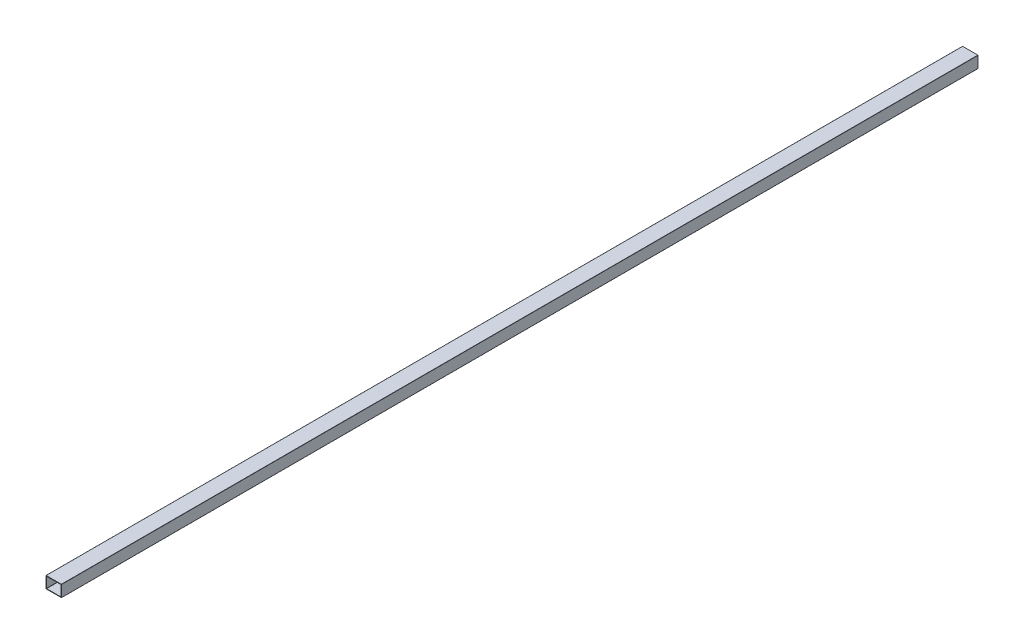
ISO-10303-21;
HEADER;
FILE_DESCRIPTION(('STEP AP214'),'2;1');
FILE_NAME('part.step','',(''),(''),'','','');
FILE_SCHEMA(('AUTOMOTIVE_DESIGN { 1 0 10303 214 1 1 1 1 }'));
ENDSEC;
DATA;
#1=APPLICATION_CONTEXT('core data for automotive mechanical design processes');
#2=APPLICATION_PROTOCOL_DEFINITION('international standard','automotive_design',2000,#1);
#3=PRODUCT_CONTEXT('',#1,'mechanical');
#4=PRODUCT('Part','Part','',(#3));
#5=PRODUCT_RELATED_PRODUCT_CATEGORY('part','',(#4));
#6=PRODUCT_DEFINITION_FORMATION('','',#4);
#7=PRODUCT_DEFINITION_CONTEXT('part definition',#1,'design');
#8=PRODUCT_DEFINITION('design','',#6,#7);
#9=PRODUCT_DEFINITION_SHAPE('','',#8);
#10=(LENGTH_UNIT() NAMED_UNIT(*) SI_UNIT(.MILLI.,.METRE.));
#11=(NAMED_UNIT(*) PLANE_ANGLE_UNIT() SI_UNIT($,.RADIAN.));
#12=(NAMED_UNIT(*) SI_UNIT($,.STERADIAN.) SOLID_ANGLE_UNIT());
#13=UNCERTAINTY_MEASURE_WITH_UNIT(LENGTH_MEASURE(1.E-05),#10,'distance_accuracy_value','');
#14=(GEOMETRIC_REPRESENTATION_CONTEXT(3) GLOBAL_UNCERTAINTY_ASSIGNED_CONTEXT((#13)) GLOBAL_UNIT_ASSIGNED_CONTEXT((#10,
#11,#12)) REPRESENTATION_CONTEXT('',''));
#15=CARTESIAN_POINT('',(0.,0.,0.));
#16=DIRECTION('',(0.,0.,1.));
#17=DIRECTION('',(1.,0.,0.));
#18=AXIS2_PLACEMENT_3D('',#15,#16,#17);
#19=CARTESIAN_POINT('',(50.8,-38.1,-6000.));
#20=DIRECTION('',(1.,0.,0.));
#21=DIRECTION('',(0.,0.,-1.));
#22=AXIS2_PLACEMENT_3D('',#19,#20,#21);
#23=PLANE('',#22);
#24=DIRECTION('',(0.,1.,0.));
#25=VECTOR('',#24,1.);
#26=CARTESIAN_POINT('',(50.8,-38.1,0.));
#27=LINE('',#26,#25);
#28=CARTESIAN_POINT('',(50.8,-37.1,0.));
#29=VERTEX_POINT('',#28);
#30=CARTESIAN_POINT('',(50.8,37.1,0.));
#31=VERTEX_POINT('',#30);
#32=EDGE_CURVE('E197',#29,#31,#27,.T.);
#33=ORIENTED_EDGE('',*,*,#32,.F.);
#34=DIRECTION('',(0.,0.,1.));
#35=VECTOR('',#34,1.);
#36=CARTESIAN_POINT('',(50.8,-37.1,-6000.));
#37=LINE('',#36,#35);
#38=CARTESIAN_POINT('',(50.8,-37.1,-6000.));
#39=VERTEX_POINT('',#38);
#40=EDGE_CURVE('E158',#29,#39,#37,.F.);
#41=ORIENTED_EDGE('',*,*,#40,.T.);
#42=DIRECTION('',(0.,1.,0.));
#43=VECTOR('',#42,1.);
#44=CARTESIAN_POINT('',(50.8,-38.1,-6000.));
#45=LINE('',#44,#43);
#46=CARTESIAN_POINT('',(50.8,37.1,-6000.));
#47=VERTEX_POINT('',#46);
#48=EDGE_CURVE('E185',#39,#47,#45,.T.);
#49=ORIENTED_EDGE('',*,*,#48,.T.);
#50=DIRECTION('',(0.,0.,1.));
#51=VECTOR('',#50,1.);
#52=CARTESIAN_POINT('',(50.8,37.1,-6000.));
#53=LINE('',#52,#51);
#54=EDGE_CURVE('E251',#47,#31,#53,.T.);
#55=ORIENTED_EDGE('',*,*,#54,.T.);
#56=EDGE_LOOP('',(#33,#41,#49,#55));
#57=FACE_BOUND('',#56,.T.);
#58=ADVANCED_FACE('F33',(#57),#23,.T.);
#59=CARTESIAN_POINT('',(-50.8,-38.1,-6000.));
#60=DIRECTION('',(0.,-1.,0.));
#61=DIRECTION('',(0.,0.,-1.));
#62=AXIS2_PLACEMENT_3D('',#59,#60,#61);
#63=PLANE('',#62);
#64=DIRECTION('',(1.,0.,0.));
#65=VECTOR('',#64,1.);
#66=CARTESIAN_POINT('',(-50.8,-38.1,0.));
#67=LINE('',#66,#65);
#68=CARTESIAN_POINT('',(-49.8,-38.1,0.));
#69=VERTEX_POINT('',#68);
#70=CARTESIAN_POINT('',(49.8,-38.1,0.));
#71=VERTEX_POINT('',#70);
#72=EDGE_CURVE('E189',#69,#71,#67,.T.);
#73=ORIENTED_EDGE('',*,*,#72,.F.);
#74=DIRECTION('',(0.,0.,1.));
#75=VECTOR('',#74,1.);
#76=CARTESIAN_POINT('',(-49.8,-38.1,-6000.));
#77=LINE('',#76,#75);
#78=CARTESIAN_POINT('',(-49.8,-38.1,-6000.));
#79=VERTEX_POINT('',#78);
#80=EDGE_CURVE('E238',#69,#79,#77,.F.);
#81=ORIENTED_EDGE('',*,*,#80,.T.);
#82=DIRECTION('',(1.,0.,0.));
#83=VECTOR('',#82,1.);
#84=CARTESIAN_POINT('',(-50.8,-38.1,-6000.));
#85=LINE('',#84,#83);
#86=CARTESIAN_POINT('',(49.8,-38.1,-6000.));
#87=VERTEX_POINT('',#86);
#88=EDGE_CURVE('E194',#79,#87,#85,.T.);
#89=ORIENTED_EDGE('',*,*,#88,.T.);
#90=DIRECTION('',(0.,0.,1.));
#91=VECTOR('',#90,1.);
#92=CARTESIAN_POINT('',(49.8,-38.1,-6000.));
#93=LINE('',#92,#91);
#94=EDGE_CURVE('E235',#87,#71,#93,.T.);
#95=ORIENTED_EDGE('',*,*,#94,.T.);
#96=EDGE_LOOP('',(#73,#81,#89,#95));
#97=FACE_BOUND('',#96,.T.);
#98=ADVANCED_FACE('F305',(#97),#63,.T.);
#99=CARTESIAN_POINT('',(-50.8,-38.1,-6000.));
#100=DIRECTION('',(-1.,0.,0.));
#101=DIRECTION('',(0.,0.,1.));
#102=AXIS2_PLACEMENT_3D('',#99,#100,#101);
#103=PLANE('',#102);
#104=DIRECTION('',(0.,-1.,0.));
#105=VECTOR('',#104,1.);
#106=CARTESIAN_POINT('',(-50.8,-38.1,-6000.));
#107=LINE('',#106,#105);
#108=CARTESIAN_POINT('',(-50.8,37.1,-6000.));
#109=VERTEX_POINT('',#108);
#110=CARTESIAN_POINT('',(-50.8,-37.1,-6000.));
#111=VERTEX_POINT('',#110);
#112=EDGE_CURVE('E191',#109,#111,#107,.T.);
#113=ORIENTED_EDGE('',*,*,#112,.T.);
#114=DIRECTION('',(0.,0.,1.));
#115=VECTOR('',#114,1.);
#116=CARTESIAN_POINT('',(-50.8,-37.1,-6000.));
#117=LINE('',#116,#115);
#118=CARTESIAN_POINT('',(-50.8,-37.1,0.));
#119=VERTEX_POINT('',#118);
#120=EDGE_CURVE('E224',#111,#119,#117,.T.);
#121=ORIENTED_EDGE('',*,*,#120,.T.);
#122=DIRECTION('',(0.,-1.,0.));
#123=VECTOR('',#122,1.);
#124=CARTESIAN_POINT('',(-50.8,-38.1,0.));
#125=LINE('',#124,#123);
#126=CARTESIAN_POINT('',(-50.8,37.1,0.));
#127=VERTEX_POINT('',#126);
#128=EDGE_CURVE('E203',#127,#119,#125,.T.);
#129=ORIENTED_EDGE('',*,*,#128,.F.);
#130=DIRECTION('',(0.,0.,1.));
#131=VECTOR('',#130,1.);
#132=CARTESIAN_POINT('',(-50.8,37.1,-6000.));
#133=LINE('',#132,#131);
#134=EDGE_CURVE('E222',#127,#109,#133,.F.);
#135=ORIENTED_EDGE('',*,*,#134,.T.);
#136=EDGE_LOOP('',(#113,#121,#129,#135));
#137=FACE_BOUND('',#136,.T.);
#138=ADVANCED_FACE('F311',(#137),#103,.T.);
#139=CARTESIAN_POINT('',(-50.8,38.1,-6000.));
#140=DIRECTION('',(0.,1.,0.));
#141=DIRECTION('',(0.,0.,1.));
#142=AXIS2_PLACEMENT_3D('',#139,#140,#141);
#143=PLANE('',#142);
#144=DIRECTION('',(-1.,0.,0.));
#145=VECTOR('',#144,1.);
#146=CARTESIAN_POINT('',(-50.8,38.1,-6000.));
#147=LINE('',#146,#145);
#148=CARTESIAN_POINT('',(49.8,38.1,-6000.));
#149=VERTEX_POINT('',#148);
#150=CARTESIAN_POINT('',(-49.8,38.1,-6000.));
#151=VERTEX_POINT('',#150);
#152=EDGE_CURVE('E188',#149,#151,#147,.T.);
#153=ORIENTED_EDGE('',*,*,#152,.T.);
#154=DIRECTION('',(0.,0.,1.));
#155=VECTOR('',#154,1.);
#156=CARTESIAN_POINT('',(-49.8,38.1,-6000.));
#157=LINE('',#156,#155);
#158=CARTESIAN_POINT('',(-49.8,38.1,0.));
#159=VERTEX_POINT('',#158);
#160=EDGE_CURVE('E248',#151,#159,#157,.T.);
#161=ORIENTED_EDGE('',*,*,#160,.T.);
#162=DIRECTION('',(-1.,0.,0.));
#163=VECTOR('',#162,1.);
#164=CARTESIAN_POINT('',(-50.8,38.1,0.));
#165=LINE('',#164,#163);
#166=CARTESIAN_POINT('',(49.8,38.1,0.));
#167=VERTEX_POINT('',#166);
#168=EDGE_CURVE('E200',#167,#159,#165,.T.);
#169=ORIENTED_EDGE('',*,*,#168,.F.);
#170=DIRECTION('',(0.,0.,1.));
#171=VECTOR('',#170,1.);
#172=CARTESIAN_POINT('',(49.8,38.1,-6000.));
#173=LINE('',#172,#171);
#174=EDGE_CURVE('E55',#167,#149,#173,.F.);
#175=ORIENTED_EDGE('',*,*,#174,.T.);
#176=EDGE_LOOP('',(#153,#161,#169,#175));
#177=FACE_BOUND('',#176,.T.);
#178=ADVANCED_FACE('F316',(#177),#143,.T.);
#179=CARTESIAN_POINT('',(0.,0.,-6000.));
#180=DIRECTION('',(0.,0.,-1.));
#181=DIRECTION('',(-1.,0.,0.));
#182=AXIS2_PLACEMENT_3D('',#179,#180,#181);
#183=PLANE('',#182);
#184=DIRECTION('',(0.,-1.,0.));
#185=VECTOR('',#184,1.);
#186=CARTESIAN_POINT('',(-47.76,-35.06,-6000.));
#187=LINE('',#186,#185);
#188=CARTESIAN_POINT('',(-47.76,34.06,-6000.));
#189=VERTEX_POINT('',#188);
#190=CARTESIAN_POINT('',(-47.76,-34.06,-6000.));
#191=VERTEX_POINT('',#190);
#192=EDGE_CURVE('E167',#189,#191,#187,.T.);
#193=ORIENTED_EDGE('',*,*,#192,.T.);
#194=CARTESIAN_POINT('',(-46.76,-34.06,-6000.));
#195=DIRECTION('',(0.,0.,-1.));
#196=DIRECTION('',(-1.,0.,0.));
#197=AXIS2_PLACEMENT_3D('',#194,#195,#196);
#198=CIRCLE('',#197,1.);
#199=CARTESIAN_POINT('',(-46.76,-35.06,-6000.));
#200=VERTEX_POINT('',#199);
#201=EDGE_CURVE('E11',#191,#200,#198,.F.);
#202=ORIENTED_EDGE('',*,*,#201,.T.);
#203=DIRECTION('',(1.,0.,0.));
#204=VECTOR('',#203,1.);
#205=CARTESIAN_POINT('',(-47.76,-35.06,-6000.));
#206=LINE('',#205,#204);
#207=CARTESIAN_POINT('',(46.76,-35.06,-6000.));
#208=VERTEX_POINT('',#207);
#209=EDGE_CURVE('E175',#200,#208,#206,.T.);
#210=ORIENTED_EDGE('',*,*,#209,.T.);
#211=CARTESIAN_POINT('',(46.76,-34.06,-6000.));
#212=DIRECTION('',(0.,0.,-1.));
#213=DIRECTION('',(-1.,0.,0.));
#214=AXIS2_PLACEMENT_3D('',#211,#212,#213);
#215=CIRCLE('',#214,1.);
#216=CARTESIAN_POINT('',(47.76,-34.06,-6000.));
#217=VERTEX_POINT('',#216);
#218=EDGE_CURVE('E262',#208,#217,#215,.F.);
#219=ORIENTED_EDGE('',*,*,#218,.T.);
#220=DIRECTION('',(0.,1.,0.));
#221=VECTOR('',#220,1.);
#222=CARTESIAN_POINT('',(47.76,-35.06,-6000.));
#223=LINE('',#222,#221);
#224=CARTESIAN_POINT('',(47.76,34.06,-6000.));
#225=VERTEX_POINT('',#224);
#226=EDGE_CURVE('E179',#217,#225,#223,.T.);
#227=ORIENTED_EDGE('',*,*,#226,.T.);
#228=CARTESIAN_POINT('',(46.76,34.06,-6000.));
#229=DIRECTION('',(0.,0.,-1.));
#230=DIRECTION('',(-1.,0.,0.));
#231=AXIS2_PLACEMENT_3D('',#228,#229,#230);
#232=CIRCLE('',#231,1.);
#233=CARTESIAN_POINT('',(46.76,35.06,-6000.));
#234=VERTEX_POINT('',#233);
#235=EDGE_CURVE('E258',#225,#234,#232,.F.);
#236=ORIENTED_EDGE('',*,*,#235,.T.);
#237=DIRECTION('',(-1.,0.,0.));
#238=VECTOR('',#237,1.);
#239=CARTESIAN_POINT('',(-47.76,35.06,-6000.));
#240=LINE('',#239,#238);
#241=CARTESIAN_POINT('',(-46.76,35.06,-6000.));
#242=VERTEX_POINT('',#241);
#243=EDGE_CURVE('E277',#234,#242,#240,.T.);
#244=ORIENTED_EDGE('',*,*,#243,.T.);
#245=CARTESIAN_POINT('',(-46.76,34.06,-6000.));
#246=DIRECTION('',(0.,0.,-1.));
#247=DIRECTION('',(-1.,0.,0.));
#248=AXIS2_PLACEMENT_3D('',#245,#246,#247);
#249=CIRCLE('',#248,1.);
#250=EDGE_CURVE('E157',#242,#189,#249,.F.);
#251=ORIENTED_EDGE('',*,*,#250,.T.);
#252=EDGE_LOOP('',(#193,#202,#210,#219,#227,#236,#244,#251));
#253=FACE_BOUND('',#252,.T.);
#254=ORIENTED_EDGE('',*,*,#88,.F.);
#255=CARTESIAN_POINT('',(-49.8,-37.1,-6000.));
#256=DIRECTION('',(0.,0.,-1.));
#257=DIRECTION('',(-1.,0.,0.));
#258=AXIS2_PLACEMENT_3D('',#255,#256,#257);
#259=CIRCLE('',#258,1.);
#260=EDGE_CURVE('E245',#79,#111,#259,.T.);
#261=ORIENTED_EDGE('',*,*,#260,.T.);
#262=ORIENTED_EDGE('',*,*,#112,.F.);
#263=CARTESIAN_POINT('',(-49.8,37.1,-6000.));
#264=DIRECTION('',(0.,0.,-1.));
#265=DIRECTION('',(-1.,0.,0.));
#266=AXIS2_PLACEMENT_3D('',#263,#264,#265);
#267=CIRCLE('',#266,1.);
#268=EDGE_CURVE('E48',#109,#151,#267,.T.);
#269=ORIENTED_EDGE('',*,*,#268,.T.);
#270=ORIENTED_EDGE('',*,*,#152,.F.);
#271=CARTESIAN_POINT('',(49.8,37.1,-6000.));
#272=DIRECTION('',(0.,0.,-1.));
#273=DIRECTION('',(-1.,0.,0.));
#274=AXIS2_PLACEMENT_3D('',#271,#272,#273);
#275=CIRCLE('',#274,1.);
#276=EDGE_CURVE('E240',#149,#47,#275,.T.);
#277=ORIENTED_EDGE('',*,*,#276,.T.);
#278=ORIENTED_EDGE('',*,*,#48,.F.);
#279=CARTESIAN_POINT('',(49.8,-37.1,-6000.));
#280=DIRECTION('',(0.,0.,-1.));
#281=DIRECTION('',(-1.,0.,0.));
#282=AXIS2_PLACEMENT_3D('',#279,#280,#281);
#283=CIRCLE('',#282,1.);
#284=EDGE_CURVE('E242',#39,#87,#283,.T.);
#285=ORIENTED_EDGE('',*,*,#284,.T.);
#286=EDGE_LOOP('',(#254,#261,#262,#269,#270,#277,#278,#285));
#287=FACE_BOUND('',#286,.T.);
#288=ADVANCED_FACE('F267',(#253,#287),#183,.T.);
#289=CARTESIAN_POINT('',(0.,0.,0.));
#290=DIRECTION('',(0.,0.,-1.));
#291=DIRECTION('',(-1.,0.,0.));
#292=AXIS2_PLACEMENT_3D('',#289,#290,#291);
#293=PLANE('',#292);
#294=DIRECTION('',(0.,1.,0.));
#295=VECTOR('',#294,1.);
#296=CARTESIAN_POINT('',(47.76,-35.06,0.));
#297=LINE('',#296,#295);
#298=CARTESIAN_POINT('',(47.76,-34.06,0.));
#299=VERTEX_POINT('',#298);
#300=CARTESIAN_POINT('',(47.76,34.06,0.));
#301=VERTEX_POINT('',#300);
#302=EDGE_CURVE('E181',#299,#301,#297,.T.);
#303=ORIENTED_EDGE('',*,*,#302,.F.);
#304=CARTESIAN_POINT('',(46.76,-34.06,0.));
#305=DIRECTION('',(0.,0.,-1.));
#306=DIRECTION('',(-1.,0.,0.));
#307=AXIS2_PLACEMENT_3D('',#304,#305,#306);
#308=CIRCLE('',#307,1.);
#309=CARTESIAN_POINT('',(46.76,-35.06,0.));
#310=VERTEX_POINT('',#309);
#311=EDGE_CURVE('E260',#299,#310,#308,.T.);
#312=ORIENTED_EDGE('',*,*,#311,.T.);
#313=DIRECTION('',(1.,0.,0.));
#314=VECTOR('',#313,1.);
#315=CARTESIAN_POINT('',(-47.76,-35.06,0.));
#316=LINE('',#315,#314);
#317=CARTESIAN_POINT('',(-46.76,-35.06,0.));
#318=VERTEX_POINT('',#317);
#319=EDGE_CURVE('E281',#318,#310,#316,.T.);
#320=ORIENTED_EDGE('',*,*,#319,.F.);
#321=CARTESIAN_POINT('',(-46.76,-34.06,0.));
#322=DIRECTION('',(0.,0.,-1.));
#323=DIRECTION('',(-1.,0.,0.));
#324=AXIS2_PLACEMENT_3D('',#321,#322,#323);
#325=CIRCLE('',#324,1.);
#326=CARTESIAN_POINT('',(-47.76,-34.06,0.));
#327=VERTEX_POINT('',#326);
#328=EDGE_CURVE('E41',#318,#327,#325,.T.);
#329=ORIENTED_EDGE('',*,*,#328,.T.);
#330=DIRECTION('',(0.,-1.,0.));
#331=VECTOR('',#330,1.);
#332=CARTESIAN_POINT('',(-47.76,-35.06,0.));
#333=LINE('',#332,#331);
#334=CARTESIAN_POINT('',(-47.76,34.06,0.));
#335=VERTEX_POINT('',#334);
#336=EDGE_CURVE('E164',#335,#327,#333,.T.);
#337=ORIENTED_EDGE('',*,*,#336,.F.);
#338=CARTESIAN_POINT('',(-46.76,34.06,0.));
#339=DIRECTION('',(0.,0.,-1.));
#340=DIRECTION('',(-1.,0.,0.));
#341=AXIS2_PLACEMENT_3D('',#338,#339,#340);
#342=CIRCLE('',#341,1.);
#343=CARTESIAN_POINT('',(-46.76,35.06,0.));
#344=VERTEX_POINT('',#343);
#345=EDGE_CURVE('E147',#335,#344,#342,.T.);
#346=ORIENTED_EDGE('',*,*,#345,.T.);
#347=DIRECTION('',(-1.,0.,0.));
#348=VECTOR('',#347,1.);
#349=CARTESIAN_POINT('',(-47.76,35.06,0.));
#350=LINE('',#349,#348);
#351=CARTESIAN_POINT('',(46.76,35.06,0.));
#352=VERTEX_POINT('',#351);
#353=EDGE_CURVE('E176',#352,#344,#350,.T.);
#354=ORIENTED_EDGE('',*,*,#353,.F.);
#355=CARTESIAN_POINT('',(46.76,34.06,0.));
#356=DIRECTION('',(0.,0.,-1.));
#357=DIRECTION('',(-1.,0.,0.));
#358=AXIS2_PLACEMENT_3D('',#355,#356,#357);
#359=CIRCLE('',#358,1.);
#360=EDGE_CURVE('E256',#352,#301,#359,.T.);
#361=ORIENTED_EDGE('',*,*,#360,.T.);
#362=EDGE_LOOP('',(#303,#312,#320,#329,#337,#346,#354,#361));
#363=FACE_BOUND('',#362,.T.);
#364=ORIENTED_EDGE('',*,*,#128,.T.);
#365=CARTESIAN_POINT('',(-49.8,-37.1,0.));
#366=DIRECTION('',(0.,0.,-1.));
#367=DIRECTION('',(-1.,0.,0.));
#368=AXIS2_PLACEMENT_3D('',#365,#366,#367);
#369=CIRCLE('',#368,1.);
#370=EDGE_CURVE('E233',#119,#69,#369,.F.);
#371=ORIENTED_EDGE('',*,*,#370,.T.);
#372=ORIENTED_EDGE('',*,*,#72,.T.);
#373=CARTESIAN_POINT('',(49.8,-37.1,0.));
#374=DIRECTION('',(0.,0.,-1.));
#375=DIRECTION('',(-1.,0.,0.));
#376=AXIS2_PLACEMENT_3D('',#373,#374,#375);
#377=CIRCLE('',#376,1.);
#378=EDGE_CURVE('E229',#71,#29,#377,.F.);
#379=ORIENTED_EDGE('',*,*,#378,.T.);
#380=ORIENTED_EDGE('',*,*,#32,.T.);
#381=CARTESIAN_POINT('',(49.8,37.1,0.));
#382=DIRECTION('',(0.,0.,-1.));
#383=DIRECTION('',(-1.,0.,0.));
#384=AXIS2_PLACEMENT_3D('',#381,#382,#383);
#385=CIRCLE('',#384,1.);
#386=EDGE_CURVE('E227',#31,#167,#385,.F.);
#387=ORIENTED_EDGE('',*,*,#386,.T.);
#388=ORIENTED_EDGE('',*,*,#168,.T.);
#389=CARTESIAN_POINT('',(-49.8,37.1,0.));
#390=DIRECTION('',(0.,0.,-1.));
#391=DIRECTION('',(-1.,0.,0.));
#392=AXIS2_PLACEMENT_3D('',#389,#390,#391);
#393=CIRCLE('',#392,1.);
#394=EDGE_CURVE('E231',#159,#127,#393,.F.);
#395=ORIENTED_EDGE('',*,*,#394,.T.);
#396=EDGE_LOOP('',(#364,#371,#372,#379,#380,#387,#388,#395));
#397=FACE_BOUND('',#396,.T.);
#398=ADVANCED_FACE('F172',(#363,#397),#293,.F.);
#399=CARTESIAN_POINT('',(-47.76,-35.06,-6000.));
#400=DIRECTION('',(0.,-1.,0.));
#401=DIRECTION('',(0.,0.,-1.));
#402=AXIS2_PLACEMENT_3D('',#399,#400,#401);
#403=PLANE('',#402);
#404=ORIENTED_EDGE('',*,*,#319,.T.);
#405=DIRECTION('',(0.,0.,1.));
#406=VECTOR('',#405,1.);
#407=CARTESIAN_POINT('',(46.76,-35.06,-6000.));
#408=LINE('',#407,#406);
#409=EDGE_CURVE('E220',#310,#208,#408,.F.);
#410=ORIENTED_EDGE('',*,*,#409,.T.);
#411=ORIENTED_EDGE('',*,*,#209,.F.);
#412=DIRECTION('',(0.,0.,1.));
#413=VECTOR('',#412,1.);
#414=CARTESIAN_POINT('',(-46.76,-35.06,0.));
#415=LINE('',#414,#413);
#416=EDGE_CURVE('E217',#200,#318,#415,.T.);
#417=ORIENTED_EDGE('',*,*,#416,.T.);
#418=EDGE_LOOP('',(#404,#410,#411,#417));
#419=FACE_BOUND('',#418,.T.);
#420=ADVANCED_FACE('F283',(#419),#403,.F.);
#421=CARTESIAN_POINT('',(-47.76,-35.06,-6000.));
#422=DIRECTION('',(-1.,0.,0.));
#423=DIRECTION('',(0.,0.,1.));
#424=AXIS2_PLACEMENT_3D('',#421,#422,#423);
#425=PLANE('',#424);
#426=ORIENTED_EDGE('',*,*,#192,.F.);
#427=DIRECTION('',(0.,0.,1.));
#428=VECTOR('',#427,1.);
#429=CARTESIAN_POINT('',(-47.76,34.06,0.));
#430=LINE('',#429,#428);
#431=EDGE_CURVE('E151',#189,#335,#430,.T.);
#432=ORIENTED_EDGE('',*,*,#431,.T.);
#433=ORIENTED_EDGE('',*,*,#336,.T.);
#434=DIRECTION('',(0.,0.,1.));
#435=VECTOR('',#434,1.);
#436=CARTESIAN_POINT('',(-47.76,-34.06,-6000.));
#437=LINE('',#436,#435);
#438=EDGE_CURVE('E169',#327,#191,#437,.F.);
#439=ORIENTED_EDGE('',*,*,#438,.T.);
#440=EDGE_LOOP('',(#426,#432,#433,#439));
#441=FACE_BOUND('',#440,.T.);
#442=ADVANCED_FACE('F163',(#441),#425,.F.);
#443=CARTESIAN_POINT('',(-47.76,35.06,-6000.));
#444=DIRECTION('',(0.,1.,0.));
#445=DIRECTION('',(0.,0.,1.));
#446=AXIS2_PLACEMENT_3D('',#443,#444,#445);
#447=PLANE('',#446);
#448=ORIENTED_EDGE('',*,*,#353,.T.);
#449=DIRECTION('',(0.,0.,1.));
#450=VECTOR('',#449,1.);
#451=CARTESIAN_POINT('',(-46.76,35.06,-6000.));
#452=LINE('',#451,#450);
#453=EDGE_CURVE('E152',#344,#242,#452,.F.);
#454=ORIENTED_EDGE('',*,*,#453,.T.);
#455=ORIENTED_EDGE('',*,*,#243,.F.);
#456=DIRECTION('',(0.,0.,1.));
#457=VECTOR('',#456,1.);
#458=CARTESIAN_POINT('',(46.76,35.06,0.));
#459=LINE('',#458,#457);
#460=EDGE_CURVE('E168',#234,#352,#459,.T.);
#461=ORIENTED_EDGE('',*,*,#460,.T.);
#462=EDGE_LOOP('',(#448,#454,#455,#461));
#463=FACE_BOUND('',#462,.T.);
#464=ADVANCED_FACE('F292',(#463),#447,.F.);
#465=CARTESIAN_POINT('',(47.76,-35.06,-6000.));
#466=DIRECTION('',(1.,0.,0.));
#467=DIRECTION('',(0.,0.,-1.));
#468=AXIS2_PLACEMENT_3D('',#465,#466,#467);
#469=PLANE('',#468);
#470=ORIENTED_EDGE('',*,*,#302,.T.);
#471=DIRECTION('',(0.,0.,1.));
#472=VECTOR('',#471,1.);
#473=CARTESIAN_POINT('',(47.76,34.06,-6000.));
#474=LINE('',#473,#472);
#475=EDGE_CURVE('E215',#301,#225,#474,.F.);
#476=ORIENTED_EDGE('',*,*,#475,.T.);
#477=ORIENTED_EDGE('',*,*,#226,.F.);
#478=DIRECTION('',(0.,0.,1.));
#479=VECTOR('',#478,1.);
#480=CARTESIAN_POINT('',(47.76,-34.06,0.));
#481=LINE('',#480,#479);
#482=EDGE_CURVE('E212',#217,#299,#481,.T.);
#483=ORIENTED_EDGE('',*,*,#482,.T.);
#484=EDGE_LOOP('',(#470,#476,#477,#483));
#485=FACE_BOUND('',#484,.T.);
#486=ADVANCED_FACE('F275',(#485),#469,.F.);
#487=CARTESIAN_POINT('',(-46.76,34.06,-6000.));
#488=DIRECTION('',(0.,0.,-1.));
#489=DIRECTION('',(-1.,0.,0.));
#490=AXIS2_PLACEMENT_3D('',#487,#488,#489);
#491=CYLINDRICAL_SURFACE('',#490,1.);
#492=ORIENTED_EDGE('',*,*,#250,.F.);
#493=ORIENTED_EDGE('',*,*,#453,.F.);
#494=ORIENTED_EDGE('',*,*,#345,.F.);
#495=ORIENTED_EDGE('',*,*,#431,.F.);
#496=EDGE_LOOP('',(#492,#493,#494,#495));
#497=FACE_BOUND('',#496,.T.);
#498=ADVANCED_FACE('F150',(#497),#491,.F.);
#499=CARTESIAN_POINT('',(46.76,34.06,-6000.));
#500=DIRECTION('',(0.,0.,-1.));
#501=DIRECTION('',(-1.,0.,0.));
#502=AXIS2_PLACEMENT_3D('',#499,#500,#501);
#503=CYLINDRICAL_SURFACE('',#502,1.);
#504=ORIENTED_EDGE('',*,*,#235,.F.);
#505=ORIENTED_EDGE('',*,*,#475,.F.);
#506=ORIENTED_EDGE('',*,*,#360,.F.);
#507=ORIENTED_EDGE('',*,*,#460,.F.);
#508=EDGE_LOOP('',(#504,#505,#506,#507));
#509=FACE_BOUND('',#508,.T.);
#510=ADVANCED_FACE('F294',(#509),#503,.F.);
#511=CARTESIAN_POINT('',(46.76,-34.06,-6000.));
#512=DIRECTION('',(0.,0.,-1.));
#513=DIRECTION('',(-1.,0.,0.));
#514=AXIS2_PLACEMENT_3D('',#511,#512,#513);
#515=CYLINDRICAL_SURFACE('',#514,1.);
#516=ORIENTED_EDGE('',*,*,#218,.F.);
#517=ORIENTED_EDGE('',*,*,#409,.F.);
#518=ORIENTED_EDGE('',*,*,#311,.F.);
#519=ORIENTED_EDGE('',*,*,#482,.F.);
#520=EDGE_LOOP('',(#516,#517,#518,#519));
#521=FACE_BOUND('',#520,.T.);
#522=ADVANCED_FACE('F279',(#521),#515,.F.);
#523=CARTESIAN_POINT('',(-49.8,-37.1,-6000.));
#524=DIRECTION('',(0.,0.,1.));
#525=DIRECTION('',(1.,0.,0.));
#526=AXIS2_PLACEMENT_3D('',#523,#524,#525);
#527=CYLINDRICAL_SURFACE('',#526,1.);
#528=ORIENTED_EDGE('',*,*,#260,.F.);
#529=ORIENTED_EDGE('',*,*,#80,.F.);
#530=ORIENTED_EDGE('',*,*,#370,.F.);
#531=ORIENTED_EDGE('',*,*,#120,.F.);
#532=EDGE_LOOP('',(#528,#529,#530,#531));
#533=FACE_BOUND('',#532,.T.);
#534=ADVANCED_FACE('F301',(#533),#527,.T.);
#535=CARTESIAN_POINT('',(-49.8,37.1,-6000.));
#536=DIRECTION('',(0.,0.,1.));
#537=DIRECTION('',(1.,0.,0.));
#538=AXIS2_PLACEMENT_3D('',#535,#536,#537);
#539=CYLINDRICAL_SURFACE('',#538,1.);
#540=ORIENTED_EDGE('',*,*,#268,.F.);
#541=ORIENTED_EDGE('',*,*,#134,.F.);
#542=ORIENTED_EDGE('',*,*,#394,.F.);
#543=ORIENTED_EDGE('',*,*,#160,.F.);
#544=EDGE_LOOP('',(#540,#541,#542,#543));
#545=FACE_BOUND('',#544,.T.);
#546=ADVANCED_FACE('F368',(#545),#539,.T.);
#547=CARTESIAN_POINT('',(-46.76,-34.06,-6000.));
#548=DIRECTION('',(0.,0.,-1.));
#549=DIRECTION('',(-1.,0.,0.));
#550=AXIS2_PLACEMENT_3D('',#547,#548,#549);
#551=CYLINDRICAL_SURFACE('',#550,1.);
#552=ORIENTED_EDGE('',*,*,#201,.F.);
#553=ORIENTED_EDGE('',*,*,#438,.F.);
#554=ORIENTED_EDGE('',*,*,#328,.F.);
#555=ORIENTED_EDGE('',*,*,#416,.F.);
#556=EDGE_LOOP('',(#552,#553,#554,#555));
#557=FACE_BOUND('',#556,.T.);
#558=ADVANCED_FACE('F378',(#557),#551,.F.);
#559=CARTESIAN_POINT('',(49.8,-37.1,-6000.));
#560=DIRECTION('',(0.,0.,1.));
#561=DIRECTION('',(1.,0.,0.));
#562=AXIS2_PLACEMENT_3D('',#559,#560,#561);
#563=CYLINDRICAL_SURFACE('',#562,1.);
#564=ORIENTED_EDGE('',*,*,#284,.F.);
#565=ORIENTED_EDGE('',*,*,#40,.F.);
#566=ORIENTED_EDGE('',*,*,#378,.F.);
#567=ORIENTED_EDGE('',*,*,#94,.F.);
#568=EDGE_LOOP('',(#564,#565,#566,#567));
#569=FACE_BOUND('',#568,.T.);
#570=ADVANCED_FACE('F388',(#569),#563,.T.);
#571=CARTESIAN_POINT('',(49.8,37.1,-6000.));
#572=DIRECTION('',(0.,0.,1.));
#573=DIRECTION('',(1.,0.,0.));
#574=AXIS2_PLACEMENT_3D('',#571,#572,#573);
#575=CYLINDRICAL_SURFACE('',#574,1.);
#576=ORIENTED_EDGE('',*,*,#276,.F.);
#577=ORIENTED_EDGE('',*,*,#174,.F.);
#578=ORIENTED_EDGE('',*,*,#386,.F.);
#579=ORIENTED_EDGE('',*,*,#54,.F.);
#580=EDGE_LOOP('',(#576,#577,#578,#579));
#581=FACE_BOUND('',#580,.T.);
#582=ADVANCED_FACE('F35',(#581),#575,.T.);
#583=CLOSED_SHELL('',(#58,#98,#138,#178,#288,#398,#420,#442,#464,#486,#498,#510,#522,#534,#546,
#558,#570,#582));
#584=MANIFOLD_SOLID_BREP('B2',#583);
#585=ADVANCED_BREP_SHAPE_REPRESENTATION('',(#18,#584),#14);
#586=SHAPE_DEFINITION_REPRESENTATION(#9,#585);
ENDSEC;
END-ISO-10303-21;
